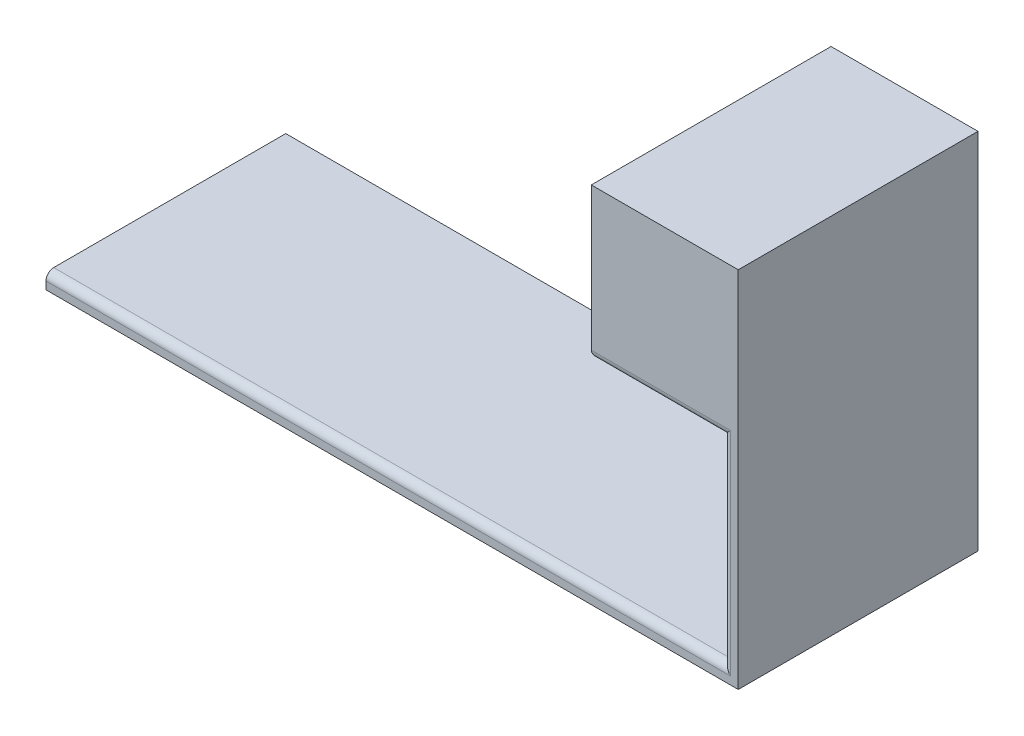
ISO-10303-21;
HEADER;
FILE_DESCRIPTION(('STEP AP214'),'2;1');
FILE_NAME('part.step','',(''),(''),'','','');
FILE_SCHEMA(('AUTOMOTIVE_DESIGN { 1 0 10303 214 1 1 1 1 }'));
ENDSEC;
DATA;
#1=APPLICATION_CONTEXT('core data for automotive mechanical design processes');
#2=APPLICATION_PROTOCOL_DEFINITION('international standard','automotive_design',2000,#1);
#3=PRODUCT_CONTEXT('',#1,'mechanical');
#4=PRODUCT('Part','Part','',(#3));
#5=PRODUCT_RELATED_PRODUCT_CATEGORY('part','',(#4));
#6=PRODUCT_DEFINITION_FORMATION('','',#4);
#7=PRODUCT_DEFINITION_CONTEXT('part definition',#1,'design');
#8=PRODUCT_DEFINITION('design','',#6,#7);
#9=PRODUCT_DEFINITION_SHAPE('','',#8);
#10=(LENGTH_UNIT() NAMED_UNIT(*) SI_UNIT(.MILLI.,.METRE.));
#11=(NAMED_UNIT(*) PLANE_ANGLE_UNIT() SI_UNIT($,.RADIAN.));
#12=(NAMED_UNIT(*) SI_UNIT($,.STERADIAN.) SOLID_ANGLE_UNIT());
#13=UNCERTAINTY_MEASURE_WITH_UNIT(LENGTH_MEASURE(1.E-05),#10,'distance_accuracy_value','');
#14=(GEOMETRIC_REPRESENTATION_CONTEXT(3) GLOBAL_UNCERTAINTY_ASSIGNED_CONTEXT((#13)) GLOBAL_UNIT_ASSIGNED_CONTEXT((#10,
#11,#12)) REPRESENTATION_CONTEXT('',''));
#15=CARTESIAN_POINT('',(0.,0.,0.));
#16=DIRECTION('',(0.,0.,1.));
#17=DIRECTION('',(1.,0.,0.));
#18=AXIS2_PLACEMENT_3D('',#15,#16,#17);
#19=CARTESIAN_POINT('',(0.,0.,62.));
#20=DIRECTION('',(1.,0.,0.));
#21=DIRECTION('',(0.,1.,0.));
#22=AXIS2_PLACEMENT_3D('',#19,#20,#21);
#23=PLANE('',#22);
#24=DIRECTION('',(0.,1.,0.));
#25=VECTOR('',#24,1.);
#26=CARTESIAN_POINT('',(0.,51.,20.2));
#27=LINE('',#26,#25);
#28=CARTESIAN_POINT('',(0.,53.,20.2));
#29=VERTEX_POINT('',#28);
#30=CARTESIAN_POINT('',(0.,81.8,20.2));
#31=VERTEX_POINT('',#30);
#32=EDGE_CURVE('E268',#29,#31,#27,.T.);
#33=ORIENTED_EDGE('',*,*,#32,.F.);
#34=DIRECTION('',(0.,0.,1.));
#35=VECTOR('',#34,1.);
#36=CARTESIAN_POINT('',(0.,53.,62.));
#37=LINE('',#36,#35);
#38=CARTESIAN_POINT('',(0.,53.,62.));
#39=VERTEX_POINT('',#38);
#40=EDGE_CURVE('E53',#29,#39,#37,.T.);
#41=ORIENTED_EDGE('',*,*,#40,.T.);
#42=DIRECTION('',(0.,-1.,0.));
#43=VECTOR('',#42,1.);
#44=CARTESIAN_POINT('',(0.,0.,62.));
#45=LINE('',#44,#43);
#46=CARTESIAN_POINT('',(0.,90.,62.));
#47=VERTEX_POINT('',#46);
#48=EDGE_CURVE('E356',#47,#39,#45,.T.);
#49=ORIENTED_EDGE('',*,*,#48,.F.);
#50=DIRECTION('',(0.,0.,-1.));
#51=VECTOR('',#50,1.);
#52=CARTESIAN_POINT('',(0.,90.,62.));
#53=LINE('',#52,#51);
#54=CARTESIAN_POINT('',(0.,90.,0.));
#55=VERTEX_POINT('',#54);
#56=EDGE_CURVE('E367',#47,#55,#53,.T.);
#57=ORIENTED_EDGE('',*,*,#56,.T.);
#58=DIRECTION('',(0.,-1.,0.));
#59=VECTOR('',#58,1.);
#60=CARTESIAN_POINT('',(0.,0.,0.));
#61=LINE('',#60,#59);
#62=CARTESIAN_POINT('',(0.,52.8,0.));
#63=VERTEX_POINT('',#62);
#64=EDGE_CURVE('E368',#55,#63,#61,.T.);
#65=ORIENTED_EDGE('',*,*,#64,.T.);
#66=DIRECTION('',(0.,0.,1.));
#67=VECTOR('',#66,1.);
#68=CARTESIAN_POINT('',(0.,52.8,-15.8));
#69=LINE('',#68,#67);
#70=CARTESIAN_POINT('',(0.,52.8,15.2));
#71=VERTEX_POINT('',#70);
#72=EDGE_CURVE('E251',#63,#71,#69,.T.);
#73=ORIENTED_EDGE('',*,*,#72,.T.);
#74=DIRECTION('',(0.,-1.,0.));
#75=VECTOR('',#74,1.);
#76=CARTESIAN_POINT('',(0.,0.,15.2));
#77=LINE('',#76,#75);
#78=CARTESIAN_POINT('',(0.,81.8,15.2));
#79=VERTEX_POINT('',#78);
#80=EDGE_CURVE('E340',#79,#71,#77,.T.);
#81=ORIENTED_EDGE('',*,*,#80,.F.);
#82=DIRECTION('',(0.,0.,-1.));
#83=VECTOR('',#82,1.);
#84=CARTESIAN_POINT('',(0.,81.8,15.2));
#85=LINE('',#84,#83);
#86=EDGE_CURVE('E273',#31,#79,#85,.T.);
#87=ORIENTED_EDGE('',*,*,#86,.F.);
#88=EDGE_LOOP('',(#33,#41,#49,#57,#65,#73,#81,#87));
#89=FACE_BOUND('',#88,.T.);
#90=ADVANCED_FACE('F43',(#89),#23,.F.);
#91=DIRECTION('',(0.,0.,-1.));
#92=VECTOR('',#91,1.);
#93=CARTESIAN_POINT('',(0.,0.,62.));
#94=LINE('',#93,#92);
#95=CARTESIAN_POINT('',(0.,0.,7.2));
#96=VERTEX_POINT('',#95);
#97=CARTESIAN_POINT('',(0.,0.,0.));
#98=VERTEX_POINT('',#97);
#99=EDGE_CURVE('E384',#96,#98,#94,.T.);
#100=ORIENTED_EDGE('',*,*,#99,.F.);
#101=DIRECTION('',(0.,-1.,0.));
#102=VECTOR('',#101,1.);
#103=CARTESIAN_POINT('',(0.,0.,7.2));
#104=LINE('',#103,#102);
#105=CARTESIAN_POINT('',(0.,3.9,7.2));
#106=VERTEX_POINT('',#105);
#107=EDGE_CURVE('E61',#106,#96,#104,.T.);
#108=ORIENTED_EDGE('',*,*,#107,.F.);
#109=DIRECTION('',(0.,0.,-1.));
#110=VECTOR('',#109,1.);
#111=CARTESIAN_POINT('',(0.,3.9,15.2));
#112=LINE('',#111,#110);
#113=CARTESIAN_POINT('',(0.,3.9,15.2));
#114=VERTEX_POINT('',#113);
#115=EDGE_CURVE('E822',#114,#106,#112,.T.);
#116=ORIENTED_EDGE('',*,*,#115,.F.);
#117=CARTESIAN_POINT('',(0.,39.8,15.2));
#118=VERTEX_POINT('',#117);
#119=EDGE_CURVE('E229',#118,#114,#77,.T.);
#120=ORIENTED_EDGE('',*,*,#119,.F.);
#121=DIRECTION('',(0.,0.,1.));
#122=VECTOR('',#121,1.);
#123=CARTESIAN_POINT('',(0.,39.8,-15.8));
#124=LINE('',#123,#122);
#125=CARTESIAN_POINT('',(0.,39.8,0.));
#126=VERTEX_POINT('',#125);
#127=EDGE_CURVE('E250',#126,#118,#124,.T.);
#128=ORIENTED_EDGE('',*,*,#127,.F.);
#129=EDGE_CURVE('E352',#126,#98,#61,.T.);
#130=ORIENTED_EDGE('',*,*,#129,.T.);
#131=EDGE_LOOP('',(#100,#108,#116,#120,#128,#130));
#132=FACE_BOUND('',#131,.T.);
#133=ADVANCED_FACE('F492',(#132),#23,.F.);
#134=CARTESIAN_POINT('',(38.,0.,62.));
#135=DIRECTION('',(-1.,0.,0.));
#136=DIRECTION('',(0.,-1.,0.));
#137=AXIS2_PLACEMENT_3D('',#134,#135,#136);
#138=PLANE('',#137);
#139=DIRECTION('',(0.,1.,0.));
#140=VECTOR('',#139,1.);
#141=CARTESIAN_POINT('',(38.,0.,0.));
#142=LINE('',#141,#140);
#143=CARTESIAN_POINT('',(38.,-4.,0.));
#144=VERTEX_POINT('',#143);
#145=CARTESIAN_POINT('',(38.,90.,0.));
#146=VERTEX_POINT('',#145);
#147=EDGE_CURVE('E372',#144,#146,#142,.T.);
#148=ORIENTED_EDGE('',*,*,#147,.T.);
#149=DIRECTION('',(0.,0.,-1.));
#150=VECTOR('',#149,1.);
#151=CARTESIAN_POINT('',(38.,90.,62.));
#152=LINE('',#151,#150);
#153=CARTESIAN_POINT('',(38.,90.,62.));
#154=VERTEX_POINT('',#153);
#155=EDGE_CURVE('E380',#154,#146,#152,.T.);
#156=ORIENTED_EDGE('',*,*,#155,.F.);
#157=DIRECTION('',(0.,1.,0.));
#158=VECTOR('',#157,1.);
#159=CARTESIAN_POINT('',(38.,0.,62.));
#160=LINE('',#159,#158);
#161=CARTESIAN_POINT('',(38.,-4.00000000000001,62.));
#162=VERTEX_POINT('',#161);
#163=EDGE_CURVE('E360',#162,#154,#160,.T.);
#164=ORIENTED_EDGE('',*,*,#163,.F.);
#165=DIRECTION('',(0.,0.,-1.));
#166=VECTOR('',#165,1.);
#167=CARTESIAN_POINT('',(38.,-4.,0.));
#168=LINE('',#167,#166);
#169=EDGE_CURVE('E295',#162,#144,#168,.T.);
#170=ORIENTED_EDGE('',*,*,#169,.T.);
#171=EDGE_LOOP('',(#148,#156,#164,#170));
#172=FACE_BOUND('',#171,.T.);
#173=ADVANCED_FACE('F498',(#172),#138,.F.);
#174=CARTESIAN_POINT('',(0.,90.,62.));
#175=DIRECTION('',(0.,-1.,0.));
#176=DIRECTION('',(0.,0.,-1.));
#177=AXIS2_PLACEMENT_3D('',#174,#175,#176);
#178=PLANE('',#177);
#179=DIRECTION('',(-1.,0.,0.));
#180=VECTOR('',#179,1.);
#181=CARTESIAN_POINT('',(0.,90.,0.));
#182=LINE('',#181,#180);
#183=EDGE_CURVE('E361',#146,#55,#182,.T.);
#184=ORIENTED_EDGE('',*,*,#183,.T.);
#185=ORIENTED_EDGE('',*,*,#56,.F.);
#186=DIRECTION('',(-1.,0.,0.));
#187=VECTOR('',#186,1.);
#188=CARTESIAN_POINT('',(0.,90.,62.));
#189=LINE('',#188,#187);
#190=EDGE_CURVE('E364',#154,#47,#189,.T.);
#191=ORIENTED_EDGE('',*,*,#190,.F.);
#192=ORIENTED_EDGE('',*,*,#155,.T.);
#193=EDGE_LOOP('',(#184,#185,#191,#192));
#194=FACE_BOUND('',#193,.T.);
#195=ADVANCED_FACE('F535',(#194),#178,.F.);
#196=CARTESIAN_POINT('',(0.,0.,62.));
#197=DIRECTION('',(0.,0.,-1.));
#198=DIRECTION('',(-1.,0.,0.));
#199=AXIS2_PLACEMENT_3D('',#196,#197,#198);
#200=PLANE('',#199);
#201=DIRECTION('',(0.,1.,0.));
#202=VECTOR('',#201,1.);
#203=CARTESIAN_POINT('',(36.,0.,62.));
#204=LINE('',#203,#202);
#205=CARTESIAN_POINT('',(36.,53.,62.));
#206=VERTEX_POINT('',#205);
#207=CARTESIAN_POINT('',(36.,-2.,62.));
#208=VERTEX_POINT('',#207);
#209=EDGE_CURVE('E420',#206,#208,#204,.F.);
#210=ORIENTED_EDGE('',*,*,#209,.T.);
#211=DIRECTION('',(1.,0.,0.));
#212=VECTOR('',#211,1.);
#213=CARTESIAN_POINT('',(-141.,-2.00000000000003,62.));
#214=LINE('',#213,#212);
#215=CARTESIAN_POINT('',(-141.,-2.00000000000003,62.));
#216=VERTEX_POINT('',#215);
#217=EDGE_CURVE('E423',#208,#216,#214,.F.);
#218=ORIENTED_EDGE('',*,*,#217,.T.);
#219=DIRECTION('',(0.,-1.,0.));
#220=VECTOR('',#219,1.);
#221=CARTESIAN_POINT('',(-141.,0.,62.));
#222=LINE('',#221,#220);
#223=CARTESIAN_POINT('',(-141.,-4.00000000000004,62.));
#224=VERTEX_POINT('',#223);
#225=EDGE_CURVE('E310',#216,#224,#222,.T.);
#226=ORIENTED_EDGE('',*,*,#225,.T.);
#227=DIRECTION('',(1.,0.,0.));
#228=VECTOR('',#227,1.);
#229=CARTESIAN_POINT('',(-141.,-4.00000000000004,62.));
#230=LINE('',#229,#228);
#231=EDGE_CURVE('E326',#224,#162,#230,.T.);
#232=ORIENTED_EDGE('',*,*,#231,.T.);
#233=ORIENTED_EDGE('',*,*,#163,.T.);
#234=ORIENTED_EDGE('',*,*,#190,.T.);
#235=ORIENTED_EDGE('',*,*,#48,.T.);
#236=DIRECTION('',(-1.,0.,0.));
#237=VECTOR('',#236,1.);
#238=CARTESIAN_POINT('',(0.,53.,62.));
#239=LINE('',#238,#237);
#240=EDGE_CURVE('E417',#39,#206,#239,.F.);
#241=ORIENTED_EDGE('',*,*,#240,.T.);
#242=EDGE_LOOP('',(#210,#218,#226,#232,#233,#234,#235,#241));
#243=FACE_BOUND('',#242,.T.);
#244=ADVANCED_FACE('F530',(#243),#200,.F.);
#245=CARTESIAN_POINT('',(0.,0.,0.));
#246=DIRECTION('',(0.,0.,-1.));
#247=DIRECTION('',(-1.,0.,0.));
#248=AXIS2_PLACEMENT_3D('',#245,#246,#247);
#249=PLANE('',#248);
#250=DIRECTION('',(1.,0.,0.));
#251=VECTOR('',#250,1.);
#252=CARTESIAN_POINT('',(0.,52.8,0.));
#253=LINE('',#252,#251);
#254=CARTESIAN_POINT('',(22.,52.8,0.));
#255=VERTEX_POINT('',#254);
#256=EDGE_CURVE('E264',#63,#255,#253,.T.);
#257=ORIENTED_EDGE('',*,*,#256,.F.);
#258=ORIENTED_EDGE('',*,*,#64,.F.);
#259=ORIENTED_EDGE('',*,*,#183,.F.);
#260=ORIENTED_EDGE('',*,*,#147,.F.);
#261=DIRECTION('',(1.,0.,0.));
#262=VECTOR('',#261,1.);
#263=CARTESIAN_POINT('',(-141.,-4.00000000000003,0.));
#264=LINE('',#263,#262);
#265=CARTESIAN_POINT('',(-141.,-4.00000000000003,0.));
#266=VERTEX_POINT('',#265);
#267=EDGE_CURVE('E321',#266,#144,#264,.T.);
#268=ORIENTED_EDGE('',*,*,#267,.F.);
#269=DIRECTION('',(0.,1.,0.));
#270=VECTOR('',#269,1.);
#271=CARTESIAN_POINT('',(-141.,0.,0.));
#272=LINE('',#271,#270);
#273=CARTESIAN_POINT('',(-141.,0.,0.));
#274=VERTEX_POINT('',#273);
#275=EDGE_CURVE('E302',#266,#274,#272,.T.);
#276=ORIENTED_EDGE('',*,*,#275,.T.);
#277=DIRECTION('',(1.,0.,0.));
#278=VECTOR('',#277,1.);
#279=CARTESIAN_POINT('',(-141.,0.,0.));
#280=LINE('',#279,#278);
#281=EDGE_CURVE('E317',#274,#98,#280,.T.);
#282=ORIENTED_EDGE('',*,*,#281,.T.);
#283=ORIENTED_EDGE('',*,*,#129,.F.);
#284=DIRECTION('',(-1.,0.,0.));
#285=VECTOR('',#284,1.);
#286=CARTESIAN_POINT('',(0.,39.8,0.));
#287=LINE('',#286,#285);
#288=CARTESIAN_POINT('',(22.,39.8,0.));
#289=VERTEX_POINT('',#288);
#290=EDGE_CURVE('E255',#289,#126,#287,.T.);
#291=ORIENTED_EDGE('',*,*,#290,.F.);
#292=CARTESIAN_POINT('',(22.,44.8,0.));
#293=DIRECTION('',(0.,0.,-1.));
#294=DIRECTION('',(-1.,0.,0.));
#295=AXIS2_PLACEMENT_3D('',#292,#293,#294);
#296=CIRCLE('',#295,5.);
#297=CARTESIAN_POINT('',(27.,44.8,0.));
#298=VERTEX_POINT('',#297);
#299=EDGE_CURVE('E404',#289,#298,#296,.F.);
#300=ORIENTED_EDGE('',*,*,#299,.T.);
#301=DIRECTION('',(0.,-1.,0.));
#302=VECTOR('',#301,1.);
#303=CARTESIAN_POINT('',(27.,0.,0.));
#304=LINE('',#303,#302);
#305=CARTESIAN_POINT('',(27.,47.8,0.));
#306=VERTEX_POINT('',#305);
#307=EDGE_CURVE('E260',#306,#298,#304,.T.);
#308=ORIENTED_EDGE('',*,*,#307,.F.);
#309=CARTESIAN_POINT('',(22.,47.8,0.));
#310=DIRECTION('',(0.,0.,-1.));
#311=DIRECTION('',(-1.,0.,0.));
#312=AXIS2_PLACEMENT_3D('',#309,#310,#311);
#313=CIRCLE('',#312,5.);
#314=EDGE_CURVE('E410',#306,#255,#313,.F.);
#315=ORIENTED_EDGE('',*,*,#314,.T.);
#316=EDGE_LOOP('',(#257,#258,#259,#260,#268,#276,#282,#283,#291,#300,#308,#315));
#317=FACE_BOUND('',#316,.T.);
#318=ADVANCED_FACE('F520',(#317),#249,.T.);
#319=CARTESIAN_POINT('',(34.,0.,15.2));
#320=DIRECTION('',(1.,0.,0.));
#321=DIRECTION('',(0.,0.,-1.));
#322=AXIS2_PLACEMENT_3D('',#319,#320,#321);
#323=PLANE('',#322);
#324=DIRECTION('',(0.,0.,1.));
#325=VECTOR('',#324,1.);
#326=CARTESIAN_POINT('',(34.,0.,15.2));
#327=LINE('',#326,#325);
#328=CARTESIAN_POINT('',(34.,0.,15.2));
#329=VERTEX_POINT('',#328);
#330=CARTESIAN_POINT('',(34.,0.,60.));
#331=VERTEX_POINT('',#330);
#332=EDGE_CURVE('E348',#329,#331,#327,.T.);
#333=ORIENTED_EDGE('',*,*,#332,.T.);
#334=DIRECTION('',(0.,1.,0.));
#335=VECTOR('',#334,1.);
#336=CARTESIAN_POINT('',(34.,0.,60.));
#337=LINE('',#336,#335);
#338=CARTESIAN_POINT('',(34.,51.,60.));
#339=VERTEX_POINT('',#338);
#340=EDGE_CURVE('E429',#331,#339,#337,.T.);
#341=ORIENTED_EDGE('',*,*,#340,.T.);
#342=DIRECTION('',(0.,0.,1.));
#343=VECTOR('',#342,1.);
#344=CARTESIAN_POINT('',(34.,51.,15.2));
#345=LINE('',#344,#343);
#346=CARTESIAN_POINT('',(34.,51.,15.2));
#347=VERTEX_POINT('',#346);
#348=EDGE_CURVE('E347',#347,#339,#345,.T.);
#349=ORIENTED_EDGE('',*,*,#348,.F.);
#350=DIRECTION('',(0.,1.,0.));
#351=VECTOR('',#350,1.);
#352=CARTESIAN_POINT('',(34.,0.,15.2));
#353=LINE('',#352,#351);
#354=EDGE_CURVE('E325',#329,#347,#353,.T.);
#355=ORIENTED_EDGE('',*,*,#354,.F.);
#356=EDGE_LOOP('',(#333,#341,#349,#355));
#357=FACE_BOUND('',#356,.T.);
#358=ADVANCED_FACE('F472',(#357),#323,.F.);
#359=CARTESIAN_POINT('',(34.,51.,15.2));
#360=DIRECTION('',(0.,1.,0.));
#361=DIRECTION('',(-1.,0.,0.));
#362=AXIS2_PLACEMENT_3D('',#359,#360,#361);
#363=PLANE('',#362);
#364=ORIENTED_EDGE('',*,*,#348,.T.);
#365=DIRECTION('',(-1.,0.,0.));
#366=VECTOR('',#365,1.);
#367=CARTESIAN_POINT('',(34.,51.,60.));
#368=LINE('',#367,#366);
#369=CARTESIAN_POINT('',(1.99999999999999,51.,60.));
#370=VERTEX_POINT('',#369);
#371=EDGE_CURVE('E435',#339,#370,#368,.T.);
#372=ORIENTED_EDGE('',*,*,#371,.T.);
#373=DIRECTION('',(0.,0.,1.));
#374=VECTOR('',#373,1.);
#375=CARTESIAN_POINT('',(1.99999999999999,51.,15.2));
#376=LINE('',#375,#374);
#377=CARTESIAN_POINT('',(1.99999999999999,51.,20.2));
#378=VERTEX_POINT('',#377);
#379=EDGE_CURVE('E432',#370,#378,#376,.F.);
#380=ORIENTED_EDGE('',*,*,#379,.T.);
#381=DIRECTION('',(-1.,0.,0.));
#382=VECTOR('',#381,1.);
#383=CARTESIAN_POINT('',(31.,51.,20.2));
#384=LINE('',#383,#382);
#385=CARTESIAN_POINT('',(31.,51.,20.2));
#386=VERTEX_POINT('',#385);
#387=EDGE_CURVE('E285',#386,#378,#384,.T.);
#388=ORIENTED_EDGE('',*,*,#387,.F.);
#389=DIRECTION('',(0.,0.,1.));
#390=VECTOR('',#389,1.);
#391=CARTESIAN_POINT('',(31.,51.,15.2));
#392=LINE('',#391,#390);
#393=CARTESIAN_POINT('',(31.,51.,15.2));
#394=VERTEX_POINT('',#393);
#395=EDGE_CURVE('E272',#394,#386,#392,.T.);
#396=ORIENTED_EDGE('',*,*,#395,.F.);
#397=DIRECTION('',(-1.,0.,0.));
#398=VECTOR('',#397,1.);
#399=CARTESIAN_POINT('',(34.,51.,15.2));
#400=LINE('',#399,#398);
#401=EDGE_CURVE('E336',#347,#394,#400,.T.);
#402=ORIENTED_EDGE('',*,*,#401,.F.);
#403=EDGE_LOOP('',(#364,#372,#380,#388,#396,#402));
#404=FACE_BOUND('',#403,.T.);
#405=ADVANCED_FACE('F461',(#404),#363,.F.);
#406=CARTESIAN_POINT('',(0.,0.,15.2));
#407=DIRECTION('',(0.,0.,1.));
#408=DIRECTION('',(1.,0.,0.));
#409=AXIS2_PLACEMENT_3D('',#406,#407,#408);
#410=PLANE('',#409);
#411=DIRECTION('',(-1.,0.,0.));
#412=VECTOR('',#411,1.);
#413=CARTESIAN_POINT('',(28.,3.9,15.2));
#414=LINE('',#413,#412);
#415=CARTESIAN_POINT('',(28.,3.9,15.2));
#416=VERTEX_POINT('',#415);
#417=EDGE_CURVE('E207',#416,#114,#414,.T.);
#418=ORIENTED_EDGE('',*,*,#417,.F.);
#419=DIRECTION('',(0.,1.,0.));
#420=VECTOR('',#419,1.);
#421=CARTESIAN_POINT('',(28.,0.,15.2));
#422=LINE('',#421,#420);
#423=CARTESIAN_POINT('',(28.,0.,15.2));
#424=VERTEX_POINT('',#423);
#425=EDGE_CURVE('E215',#424,#416,#422,.T.);
#426=ORIENTED_EDGE('',*,*,#425,.F.);
#427=DIRECTION('',(1.,0.,0.));
#428=VECTOR('',#427,1.);
#429=CARTESIAN_POINT('',(34.,0.,15.2));
#430=LINE('',#429,#428);
#431=EDGE_CURVE('E344',#424,#329,#430,.T.);
#432=ORIENTED_EDGE('',*,*,#431,.T.);
#433=ORIENTED_EDGE('',*,*,#354,.T.);
#434=ORIENTED_EDGE('',*,*,#401,.T.);
#435=DIRECTION('',(0.,-1.,0.));
#436=VECTOR('',#435,1.);
#437=CARTESIAN_POINT('',(31.,51.,15.2));
#438=LINE('',#437,#436);
#439=CARTESIAN_POINT('',(31.,81.8,15.2));
#440=VERTEX_POINT('',#439);
#441=EDGE_CURVE('E269',#440,#394,#438,.T.);
#442=ORIENTED_EDGE('',*,*,#441,.F.);
#443=DIRECTION('',(-1.,0.,0.));
#444=VECTOR('',#443,1.);
#445=CARTESIAN_POINT('',(31.,81.8,15.2));
#446=LINE('',#445,#444);
#447=EDGE_CURVE('E291',#440,#79,#446,.T.);
#448=ORIENTED_EDGE('',*,*,#447,.T.);
#449=ORIENTED_EDGE('',*,*,#80,.T.);
#450=DIRECTION('',(-1.,0.,0.));
#451=VECTOR('',#450,1.);
#452=CARTESIAN_POINT('',(0.,52.8,15.2));
#453=LINE('',#452,#451);
#454=CARTESIAN_POINT('',(22.,52.8,15.2));
#455=VERTEX_POINT('',#454);
#456=EDGE_CURVE('E247',#455,#71,#453,.T.);
#457=ORIENTED_EDGE('',*,*,#456,.F.);
#458=CARTESIAN_POINT('',(22.,47.8,15.2));
#459=DIRECTION('',(0.,0.,1.));
#460=DIRECTION('',(1.,0.,0.));
#461=AXIS2_PLACEMENT_3D('',#458,#459,#460);
#462=CIRCLE('',#461,5.);
#463=CARTESIAN_POINT('',(27.,47.8,15.2));
#464=VERTEX_POINT('',#463);
#465=EDGE_CURVE('E407',#455,#464,#462,.F.);
#466=ORIENTED_EDGE('',*,*,#465,.T.);
#467=DIRECTION('',(0.,1.,0.));
#468=VECTOR('',#467,1.);
#469=CARTESIAN_POINT('',(27.,52.8,15.2));
#470=LINE('',#469,#468);
#471=CARTESIAN_POINT('',(27.,44.8,15.2));
#472=VERTEX_POINT('',#471);
#473=EDGE_CURVE('E243',#472,#464,#470,.T.);
#474=ORIENTED_EDGE('',*,*,#473,.F.);
#475=CARTESIAN_POINT('',(22.,44.8,15.2));
#476=DIRECTION('',(0.,0.,1.));
#477=DIRECTION('',(1.,0.,0.));
#478=AXIS2_PLACEMENT_3D('',#475,#476,#477);
#479=CIRCLE('',#478,5.);
#480=CARTESIAN_POINT('',(22.,39.8,15.2));
#481=VERTEX_POINT('',#480);
#482=EDGE_CURVE('E401',#472,#481,#479,.F.);
#483=ORIENTED_EDGE('',*,*,#482,.T.);
#484=DIRECTION('',(1.,0.,0.));
#485=VECTOR('',#484,1.);
#486=CARTESIAN_POINT('',(0.,39.8,15.2));
#487=LINE('',#486,#485);
#488=EDGE_CURVE('E239',#118,#481,#487,.T.);
#489=ORIENTED_EDGE('',*,*,#488,.F.);
#490=ORIENTED_EDGE('',*,*,#119,.T.);
#491=EDGE_LOOP('',(#418,#426,#432,#433,#434,#442,#448,#449,#457,#466,#474,#483,#489,#490));
#492=FACE_BOUND('',#491,.T.);
#493=ADVANCED_FACE('F226',(#492),#410,.T.);
#494=CARTESIAN_POINT('',(-141.,0.,0.));
#495=DIRECTION('',(0.,1.,0.));
#496=DIRECTION('',(-1.,0.,0.));
#497=AXIS2_PLACEMENT_3D('',#494,#495,#496);
#498=PLANE('',#497);
#499=ORIENTED_EDGE('',*,*,#431,.F.);
#500=DIRECTION('',(0.,0.,1.));
#501=VECTOR('',#500,1.);
#502=CARTESIAN_POINT('',(28.,0.,15.2));
#503=LINE('',#502,#501);
#504=CARTESIAN_POINT('',(28.,0.,7.2));
#505=VERTEX_POINT('',#504);
#506=EDGE_CURVE('E220',#505,#424,#503,.T.);
#507=ORIENTED_EDGE('',*,*,#506,.F.);
#508=DIRECTION('',(-1.,0.,0.));
#509=VECTOR('',#508,1.);
#510=CARTESIAN_POINT('',(28.,0.,7.2));
#511=LINE('',#510,#509);
#512=EDGE_CURVE('E234',#505,#96,#511,.T.);
#513=ORIENTED_EDGE('',*,*,#512,.T.);
#514=ORIENTED_EDGE('',*,*,#99,.T.);
#515=ORIENTED_EDGE('',*,*,#281,.F.);
#516=DIRECTION('',(0.,0.,1.));
#517=VECTOR('',#516,1.);
#518=CARTESIAN_POINT('',(-141.,0.,0.));
#519=LINE('',#518,#517);
#520=CARTESIAN_POINT('',(-141.,0.,60.));
#521=VERTEX_POINT('',#520);
#522=EDGE_CURVE('E306',#274,#521,#519,.T.);
#523=ORIENTED_EDGE('',*,*,#522,.T.);
#524=DIRECTION('',(1.,0.,0.));
#525=VECTOR('',#524,1.);
#526=CARTESIAN_POINT('',(34.,0.,60.));
#527=LINE('',#526,#525);
#528=EDGE_CURVE('E413',#521,#331,#527,.T.);
#529=ORIENTED_EDGE('',*,*,#528,.T.);
#530=ORIENTED_EDGE('',*,*,#332,.F.);
#531=EDGE_LOOP('',(#499,#507,#513,#514,#515,#523,#529,#530));
#532=FACE_BOUND('',#531,.T.);
#533=ADVANCED_FACE('F474',(#532),#498,.T.);
#534=CARTESIAN_POINT('',(-141.,-4.00000000000003,0.));
#535=DIRECTION('',(0.,-1.,0.));
#536=DIRECTION('',(1.,0.,0.));
#537=AXIS2_PLACEMENT_3D('',#534,#535,#536);
#538=PLANE('',#537);
#539=ORIENTED_EDGE('',*,*,#169,.F.);
#540=ORIENTED_EDGE('',*,*,#231,.F.);
#541=DIRECTION('',(0.,0.,-1.));
#542=VECTOR('',#541,1.);
#543=CARTESIAN_POINT('',(-141.,-4.00000000000003,0.));
#544=LINE('',#543,#542);
#545=EDGE_CURVE('E313',#224,#266,#544,.T.);
#546=ORIENTED_EDGE('',*,*,#545,.T.);
#547=ORIENTED_EDGE('',*,*,#267,.T.);
#548=EDGE_LOOP('',(#539,#540,#546,#547));
#549=FACE_BOUND('',#548,.T.);
#550=ADVANCED_FACE('F541',(#549),#538,.T.);
#551=CARTESIAN_POINT('',(-141.,0.,0.));
#552=DIRECTION('',(-1.,0.,0.));
#553=DIRECTION('',(0.,0.,1.));
#554=AXIS2_PLACEMENT_3D('',#551,#552,#553);
#555=PLANE('',#554);
#556=ORIENTED_EDGE('',*,*,#225,.F.);
#557=CARTESIAN_POINT('',(-141.,-2.00000000000003,60.));
#558=DIRECTION('',(-1.,0.,0.));
#559=DIRECTION('',(0.,0.,1.));
#560=AXIS2_PLACEMENT_3D('',#557,#558,#559);
#561=CIRCLE('',#560,2.);
#562=EDGE_CURVE('E426',#216,#521,#561,.T.);
#563=ORIENTED_EDGE('',*,*,#562,.T.);
#564=ORIENTED_EDGE('',*,*,#522,.F.);
#565=ORIENTED_EDGE('',*,*,#275,.F.);
#566=ORIENTED_EDGE('',*,*,#545,.F.);
#567=EDGE_LOOP('',(#556,#563,#564,#565,#566));
#568=FACE_BOUND('',#567,.T.);
#569=ADVANCED_FACE('F546',(#568),#555,.T.);
#570=CARTESIAN_POINT('',(31.,81.8,15.2));
#571=DIRECTION('',(0.,1.,0.));
#572=DIRECTION('',(-1.,0.,0.));
#573=AXIS2_PLACEMENT_3D('',#570,#571,#572);
#574=PLANE('',#573);
#575=ORIENTED_EDGE('',*,*,#86,.T.);
#576=ORIENTED_EDGE('',*,*,#447,.F.);
#577=DIRECTION('',(0.,0.,-1.));
#578=VECTOR('',#577,1.);
#579=CARTESIAN_POINT('',(31.,81.8,15.2));
#580=LINE('',#579,#578);
#581=CARTESIAN_POINT('',(31.,81.8,20.2));
#582=VERTEX_POINT('',#581);
#583=EDGE_CURVE('E281',#582,#440,#580,.T.);
#584=ORIENTED_EDGE('',*,*,#583,.F.);
#585=DIRECTION('',(-1.,0.,0.));
#586=VECTOR('',#585,1.);
#587=CARTESIAN_POINT('',(31.,81.8,20.2));
#588=LINE('',#587,#586);
#589=EDGE_CURVE('E296',#582,#31,#588,.T.);
#590=ORIENTED_EDGE('',*,*,#589,.T.);
#591=EDGE_LOOP('',(#575,#576,#584,#590));
#592=FACE_BOUND('',#591,.T.);
#593=ADVANCED_FACE('F527',(#592),#574,.F.);
#594=CARTESIAN_POINT('',(31.,51.,20.2));
#595=DIRECTION('',(0.,0.,1.));
#596=DIRECTION('',(1.,0.,0.));
#597=AXIS2_PLACEMENT_3D('',#594,#595,#596);
#598=PLANE('',#597);
#599=ORIENTED_EDGE('',*,*,#387,.T.);
#600=CARTESIAN_POINT('',(1.99999999999999,53.,20.2));
#601=DIRECTION('',(0.,0.,1.));
#602=DIRECTION('',(1.,0.,0.));
#603=AXIS2_PLACEMENT_3D('',#600,#601,#602);
#604=CIRCLE('',#603,2.);
#605=EDGE_CURVE('E11',#378,#29,#604,.F.);
#606=ORIENTED_EDGE('',*,*,#605,.T.);
#607=ORIENTED_EDGE('',*,*,#32,.T.);
#608=ORIENTED_EDGE('',*,*,#589,.F.);
#609=DIRECTION('',(0.,1.,0.));
#610=VECTOR('',#609,1.);
#611=CARTESIAN_POINT('',(31.,51.,20.2));
#612=LINE('',#611,#610);
#613=EDGE_CURVE('E277',#386,#582,#612,.T.);
#614=ORIENTED_EDGE('',*,*,#613,.F.);
#615=EDGE_LOOP('',(#599,#606,#607,#608,#614));
#616=FACE_BOUND('',#615,.T.);
#617=ADVANCED_FACE('F463',(#616),#598,.F.);
#618=CARTESIAN_POINT('',(31.,0.,0.));
#619=DIRECTION('',(1.,0.,0.));
#620=DIRECTION('',(0.,1.,0.));
#621=AXIS2_PLACEMENT_3D('',#618,#619,#620);
#622=PLANE('',#621);
#623=ORIENTED_EDGE('',*,*,#441,.T.);
#624=ORIENTED_EDGE('',*,*,#395,.T.);
#625=ORIENTED_EDGE('',*,*,#613,.T.);
#626=ORIENTED_EDGE('',*,*,#583,.T.);
#627=EDGE_LOOP('',(#623,#624,#625,#626));
#628=FACE_BOUND('',#627,.T.);
#629=ADVANCED_FACE('F466',(#628),#622,.F.);
#630=CARTESIAN_POINT('',(0.,52.8,-15.8));
#631=DIRECTION('',(0.,1.,0.));
#632=DIRECTION('',(0.,0.,1.));
#633=AXIS2_PLACEMENT_3D('',#630,#631,#632);
#634=PLANE('',#633);
#635=ORIENTED_EDGE('',*,*,#256,.T.);
#636=DIRECTION('',(0.,0.,1.));
#637=VECTOR('',#636,1.);
#638=CARTESIAN_POINT('',(22.,52.8,15.2));
#639=LINE('',#638,#637);
#640=EDGE_CURVE('E397',#255,#455,#639,.T.);
#641=ORIENTED_EDGE('',*,*,#640,.T.);
#642=ORIENTED_EDGE('',*,*,#456,.T.);
#643=ORIENTED_EDGE('',*,*,#72,.F.);
#644=EDGE_LOOP('',(#635,#641,#642,#643));
#645=FACE_BOUND('',#644,.T.);
#646=ADVANCED_FACE('F523',(#645),#634,.F.);
#647=CARTESIAN_POINT('',(27.,52.8,-15.8));
#648=DIRECTION('',(1.,0.,0.));
#649=DIRECTION('',(0.,0.,-1.));
#650=AXIS2_PLACEMENT_3D('',#647,#648,#649);
#651=PLANE('',#650);
#652=ORIENTED_EDGE('',*,*,#307,.T.);
#653=DIRECTION('',(0.,0.,1.));
#654=VECTOR('',#653,1.);
#655=CARTESIAN_POINT('',(27.,44.8,15.2));
#656=LINE('',#655,#654);
#657=EDGE_CURVE('E390',#298,#472,#656,.T.);
#658=ORIENTED_EDGE('',*,*,#657,.T.);
#659=ORIENTED_EDGE('',*,*,#473,.T.);
#660=DIRECTION('',(0.,0.,1.));
#661=VECTOR('',#660,1.);
#662=CARTESIAN_POINT('',(27.,47.8,0.));
#663=LINE('',#662,#661);
#664=EDGE_CURVE('E387',#464,#306,#663,.F.);
#665=ORIENTED_EDGE('',*,*,#664,.T.);
#666=EDGE_LOOP('',(#652,#658,#659,#665));
#667=FACE_BOUND('',#666,.T.);
#668=ADVANCED_FACE('F560',(#667),#651,.F.);
#669=CARTESIAN_POINT('',(0.,39.8,-15.8));
#670=DIRECTION('',(0.,-1.,0.));
#671=DIRECTION('',(1.,0.,0.));
#672=AXIS2_PLACEMENT_3D('',#669,#670,#671);
#673=PLANE('',#672);
#674=ORIENTED_EDGE('',*,*,#488,.T.);
#675=DIRECTION('',(0.,0.,1.));
#676=VECTOR('',#675,1.);
#677=CARTESIAN_POINT('',(22.,39.8,0.));
#678=LINE('',#677,#676);
#679=EDGE_CURVE('E394',#481,#289,#678,.F.);
#680=ORIENTED_EDGE('',*,*,#679,.T.);
#681=ORIENTED_EDGE('',*,*,#290,.T.);
#682=ORIENTED_EDGE('',*,*,#127,.T.);
#683=EDGE_LOOP('',(#674,#680,#681,#682));
#684=FACE_BOUND('',#683,.T.);
#685=ADVANCED_FACE('F507',(#684),#673,.F.);
#686=CARTESIAN_POINT('',(22.,44.8,-15.8));
#687=DIRECTION('',(0.,0.,-1.));
#688=DIRECTION('',(-1.,0.,0.));
#689=AXIS2_PLACEMENT_3D('',#686,#687,#688);
#690=CYLINDRICAL_SURFACE('',#689,5.);
#691=ORIENTED_EDGE('',*,*,#299,.F.);
#692=ORIENTED_EDGE('',*,*,#679,.F.);
#693=ORIENTED_EDGE('',*,*,#482,.F.);
#694=ORIENTED_EDGE('',*,*,#657,.F.);
#695=EDGE_LOOP('',(#691,#692,#693,#694));
#696=FACE_BOUND('',#695,.T.);
#697=ADVANCED_FACE('F503',(#696),#690,.F.);
#698=CARTESIAN_POINT('',(22.,47.8,-15.8));
#699=DIRECTION('',(0.,0.,-1.));
#700=DIRECTION('',(-1.,0.,0.));
#701=AXIS2_PLACEMENT_3D('',#698,#699,#700);
#702=CYLINDRICAL_SURFACE('',#701,5.);
#703=ORIENTED_EDGE('',*,*,#314,.F.);
#704=ORIENTED_EDGE('',*,*,#664,.F.);
#705=ORIENTED_EDGE('',*,*,#465,.F.);
#706=ORIENTED_EDGE('',*,*,#640,.F.);
#707=EDGE_LOOP('',(#703,#704,#705,#706));
#708=FACE_BOUND('',#707,.T.);
#709=ADVANCED_FACE('F506',(#708),#702,.F.);
#710=CARTESIAN_POINT('',(1.99999999999999,53.,62.));
#711=DIRECTION('',(0.,0.,1.));
#712=DIRECTION('',(1.,0.,0.));
#713=AXIS2_PLACEMENT_3D('',#710,#711,#712);
#714=CYLINDRICAL_SURFACE('',#713,2.);
#715=ORIENTED_EDGE('',*,*,#605,.F.);
#716=ORIENTED_EDGE('',*,*,#379,.F.);
#717=CARTESIAN_POINT('',(1.99999999999999,53.,60.));
#718=DIRECTION('',(0.707106781186547,0.,0.707106781186547));
#719=DIRECTION('',(-0.707106781186547,0.,0.707106781186547));
#720=AXIS2_PLACEMENT_3D('',#717,#718,#719);
#721=ELLIPSE('',#720,2.82842712474619,2.);
#722=EDGE_CURVE('E47',#39,#370,#721,.T.);
#723=ORIENTED_EDGE('',*,*,#722,.F.);
#724=ORIENTED_EDGE('',*,*,#40,.F.);
#725=EDGE_LOOP('',(#715,#716,#723,#724));
#726=FACE_BOUND('',#725,.T.);
#727=ADVANCED_FACE('F45',(#726),#714,.T.);
#728=CARTESIAN_POINT('',(34.,53.,60.));
#729=DIRECTION('',(-1.,0.,0.));
#730=DIRECTION('',(0.,-1.,0.));
#731=AXIS2_PLACEMENT_3D('',#728,#729,#730);
#732=CYLINDRICAL_SURFACE('',#731,2.);
#733=ORIENTED_EDGE('',*,*,#722,.T.);
#734=ORIENTED_EDGE('',*,*,#371,.F.);
#735=CARTESIAN_POINT('',(36.,53.,60.));
#736=DIRECTION('',(-0.707106781186548,0.707106781186547,0.));
#737=DIRECTION('',(0.707106781186547,0.707106781186548,0.));
#738=AXIS2_PLACEMENT_3D('',#735,#736,#737);
#739=ELLIPSE('',#738,2.82842712474619,2.);
#740=EDGE_CURVE('E442',#206,#339,#739,.F.);
#741=ORIENTED_EDGE('',*,*,#740,.F.);
#742=ORIENTED_EDGE('',*,*,#240,.F.);
#743=EDGE_LOOP('',(#733,#734,#741,#742));
#744=FACE_BOUND('',#743,.T.);
#745=ADVANCED_FACE('F455',(#744),#732,.T.);
#746=CARTESIAN_POINT('',(36.,0.,60.));
#747=DIRECTION('',(0.,1.,0.));
#748=DIRECTION('',(0.,0.,1.));
#749=AXIS2_PLACEMENT_3D('',#746,#747,#748);
#750=CYLINDRICAL_SURFACE('',#749,2.);
#751=ORIENTED_EDGE('',*,*,#740,.T.);
#752=ORIENTED_EDGE('',*,*,#340,.F.);
#753=CARTESIAN_POINT('',(36.,-2.,60.));
#754=DIRECTION('',(-0.707106781186547,-0.707106781186548,0.));
#755=DIRECTION('',(-0.707106781186548,0.707106781186547,0.));
#756=AXIS2_PLACEMENT_3D('',#753,#754,#755);
#757=ELLIPSE('',#756,2.82842712474619,2.);
#758=EDGE_CURVE('E440',#208,#331,#757,.T.);
#759=ORIENTED_EDGE('',*,*,#758,.F.);
#760=ORIENTED_EDGE('',*,*,#209,.F.);
#761=EDGE_LOOP('',(#751,#752,#759,#760));
#762=FACE_BOUND('',#761,.T.);
#763=ADVANCED_FACE('F482',(#762),#750,.T.);
#764=CARTESIAN_POINT('',(-141.,-2.00000000000003,60.));
#765=DIRECTION('',(-1.,0.,0.));
#766=DIRECTION('',(0.,-1.,0.));
#767=AXIS2_PLACEMENT_3D('',#764,#765,#766);
#768=CYLINDRICAL_SURFACE('',#767,2.);
#769=ORIENTED_EDGE('',*,*,#562,.F.);
#770=ORIENTED_EDGE('',*,*,#217,.F.);
#771=ORIENTED_EDGE('',*,*,#758,.T.);
#772=ORIENTED_EDGE('',*,*,#528,.F.);
#773=EDGE_LOOP('',(#769,#770,#771,#772));
#774=FACE_BOUND('',#773,.T.);
#775=ADVANCED_FACE('F479',(#774),#768,.T.);
#776=CARTESIAN_POINT('',(28.,0.,7.2));
#777=DIRECTION('',(0.,0.,-1.));
#778=DIRECTION('',(-1.,0.,0.));
#779=AXIS2_PLACEMENT_3D('',#776,#777,#778);
#780=PLANE('',#779);
#781=ORIENTED_EDGE('',*,*,#107,.T.);
#782=ORIENTED_EDGE('',*,*,#512,.F.);
#783=DIRECTION('',(0.,-1.,0.));
#784=VECTOR('',#783,1.);
#785=CARTESIAN_POINT('',(28.,0.,7.2));
#786=LINE('',#785,#784);
#787=CARTESIAN_POINT('',(28.,3.9,7.2));
#788=VERTEX_POINT('',#787);
#789=EDGE_CURVE('E214',#788,#505,#786,.T.);
#790=ORIENTED_EDGE('',*,*,#789,.F.);
#791=DIRECTION('',(-1.,0.,0.));
#792=VECTOR('',#791,1.);
#793=CARTESIAN_POINT('',(28.,3.9,7.2));
#794=LINE('',#793,#792);
#795=EDGE_CURVE('E209',#788,#106,#794,.T.);
#796=ORIENTED_EDGE('',*,*,#795,.T.);
#797=EDGE_LOOP('',(#781,#782,#790,#796));
#798=FACE_BOUND('',#797,.T.);
#799=ADVANCED_FACE('F489',(#798),#780,.F.);
#800=CARTESIAN_POINT('',(28.,3.9,15.2));
#801=DIRECTION('',(0.,1.,0.));
#802=DIRECTION('',(-1.,0.,0.));
#803=AXIS2_PLACEMENT_3D('',#800,#801,#802);
#804=PLANE('',#803);
#805=ORIENTED_EDGE('',*,*,#115,.T.);
#806=ORIENTED_EDGE('',*,*,#795,.F.);
#807=DIRECTION('',(0.,0.,-1.));
#808=VECTOR('',#807,1.);
#809=CARTESIAN_POINT('',(28.,3.9,15.2));
#810=LINE('',#809,#808);
#811=EDGE_CURVE('E202',#416,#788,#810,.T.);
#812=ORIENTED_EDGE('',*,*,#811,.F.);
#813=ORIENTED_EDGE('',*,*,#417,.T.);
#814=EDGE_LOOP('',(#805,#806,#812,#813));
#815=FACE_BOUND('',#814,.T.);
#816=ADVANCED_FACE('F205',(#815),#804,.F.);
#817=CARTESIAN_POINT('',(28.,0.,0.));
#818=DIRECTION('',(-1.,0.,0.));
#819=DIRECTION('',(0.,-1.,0.));
#820=AXIS2_PLACEMENT_3D('',#817,#818,#819);
#821=PLANE('',#820);
#822=ORIENTED_EDGE('',*,*,#425,.T.);
#823=ORIENTED_EDGE('',*,*,#811,.T.);
#824=ORIENTED_EDGE('',*,*,#789,.T.);
#825=ORIENTED_EDGE('',*,*,#506,.T.);
#826=EDGE_LOOP('',(#822,#823,#824,#825));
#827=FACE_BOUND('',#826,.T.);
#828=ADVANCED_FACE('F218',(#827),#821,.T.);
#829=CLOSED_SHELL('',(#90,#133,#173,#195,#244,#318,#358,#405,#493,#533,#550,#569,#593,#617,#629,
#646,#668,#685,#697,#709,#727,#745,#763,#775,#799,#816,#828));
#830=MANIFOLD_SOLID_BREP('B2',#829);
#831=ADVANCED_BREP_SHAPE_REPRESENTATION('',(#18,#830),#14);
#832=SHAPE_DEFINITION_REPRESENTATION(#9,#831);
ENDSEC;
END-ISO-10303-21;
